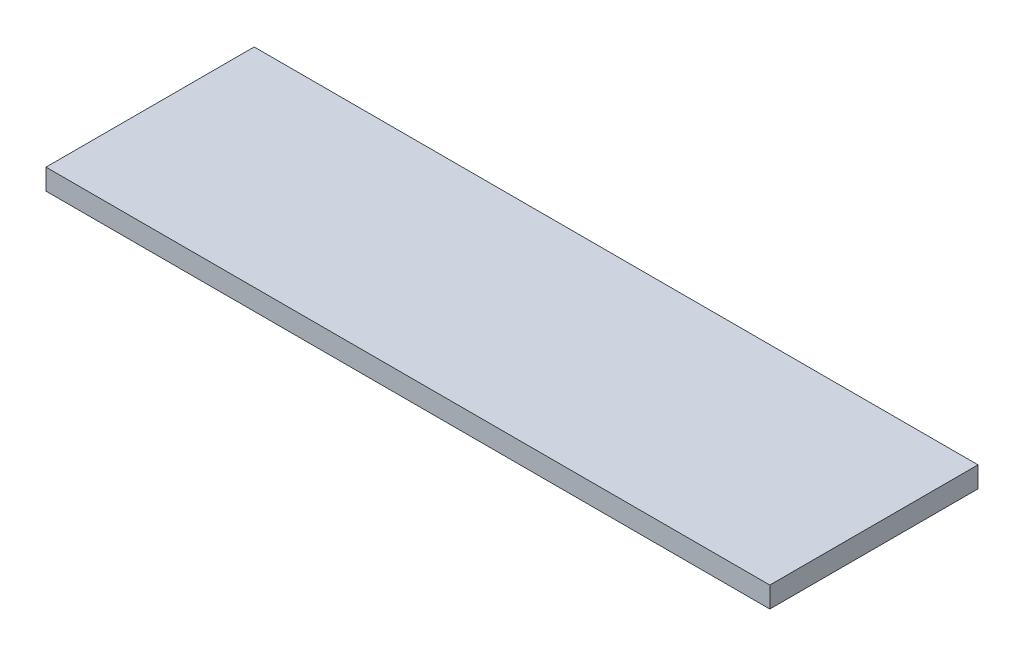
ISO-10303-21;
HEADER;
FILE_DESCRIPTION(('STEP AP214'),'2;1');
FILE_NAME('part.step','',(''),(''),'','','');
FILE_SCHEMA(('AUTOMOTIVE_DESIGN { 1 0 10303 214 1 1 1 1 }'));
ENDSEC;
DATA;
#1=APPLICATION_CONTEXT('core data for automotive mechanical design processes');
#2=APPLICATION_PROTOCOL_DEFINITION('international standard','automotive_design',2000,#1);
#3=PRODUCT_CONTEXT('',#1,'mechanical');
#4=PRODUCT('Part','Part','',(#3));
#5=PRODUCT_RELATED_PRODUCT_CATEGORY('part','',(#4));
#6=PRODUCT_DEFINITION_FORMATION('','',#4);
#7=PRODUCT_DEFINITION_CONTEXT('part definition',#1,'design');
#8=PRODUCT_DEFINITION('design','',#6,#7);
#9=PRODUCT_DEFINITION_SHAPE('','',#8);
#10=(LENGTH_UNIT() NAMED_UNIT(*) SI_UNIT(.MILLI.,.METRE.));
#11=(NAMED_UNIT(*) PLANE_ANGLE_UNIT() SI_UNIT($,.RADIAN.));
#12=(NAMED_UNIT(*) SI_UNIT($,.STERADIAN.) SOLID_ANGLE_UNIT());
#13=UNCERTAINTY_MEASURE_WITH_UNIT(LENGTH_MEASURE(1.E-05),#10,'distance_accuracy_value','');
#14=(GEOMETRIC_REPRESENTATION_CONTEXT(3) GLOBAL_UNCERTAINTY_ASSIGNED_CONTEXT((#13)) GLOBAL_UNIT_ASSIGNED_CONTEXT((#10,
#11,#12)) REPRESENTATION_CONTEXT('',''));
#15=CARTESIAN_POINT('',(0.,0.,0.));
#16=DIRECTION('',(0.,0.,1.));
#17=DIRECTION('',(1.,0.,0.));
#18=AXIS2_PLACEMENT_3D('',#15,#16,#17);
#19=CARTESIAN_POINT('',(18.7699111843078,2.,10.));
#20=DIRECTION('',(0.,0.,1.));
#21=DIRECTION('',(0.,-1.,0.));
#22=AXIS2_PLACEMENT_3D('',#19,#20,#21);
#23=PLANE('',#22);
#24=DIRECTION('',(1.,0.,0.));
#25=VECTOR('',#24,1.);
#26=CARTESIAN_POINT('',(19.7699111843078,0.,10.));
#27=LINE('',#26,#25);
#28=CARTESIAN_POINT('',(0.,0.,10.));
#29=VERTEX_POINT('',#28);
#30=CARTESIAN_POINT('',(34.7699111843078,0.,10.));
#31=VERTEX_POINT('',#30);
#32=EDGE_CURVE('E102',#29,#31,#27,.T.);
#33=ORIENTED_EDGE('',*,*,#32,.F.);
#34=DIRECTION('',(0.,1.,0.));
#35=VECTOR('',#34,1.);
#36=CARTESIAN_POINT('',(0.,-1.,10.));
#37=LINE('',#36,#35);
#38=CARTESIAN_POINT('',(0.,-1.,10.));
#39=VERTEX_POINT('',#38);
#40=EDGE_CURVE('E99',#39,#29,#37,.T.);
#41=ORIENTED_EDGE('',*,*,#40,.F.);
#42=DIRECTION('',(1.,0.,0.));
#43=VECTOR('',#42,1.);
#44=CARTESIAN_POINT('',(19.7699111843078,-1.,10.));
#45=LINE('',#44,#43);
#46=CARTESIAN_POINT('',(34.7699111843078,-1.,10.));
#47=VERTEX_POINT('',#46);
#48=EDGE_CURVE('E88',#39,#47,#45,.T.);
#49=ORIENTED_EDGE('',*,*,#48,.T.);
#50=DIRECTION('',(0.,-1.,0.));
#51=VECTOR('',#50,1.);
#52=CARTESIAN_POINT('',(34.7699111843078,0.,10.));
#53=LINE('',#52,#51);
#54=EDGE_CURVE('E91',#31,#47,#53,.T.);
#55=ORIENTED_EDGE('',*,*,#54,.F.);
#56=EDGE_LOOP('',(#33,#41,#49,#55));
#57=FACE_BOUND('',#56,.T.);
#58=ADVANCED_FACE('F44',(#57),#23,.T.);
#59=CARTESIAN_POINT('',(19.7699111843078,-1.,10.));
#60=DIRECTION('',(0.,1.,0.));
#61=DIRECTION('',(0.,0.,1.));
#62=AXIS2_PLACEMENT_3D('',#59,#60,#61);
#63=PLANE('',#62);
#64=DIRECTION('',(1.,0.,0.));
#65=VECTOR('',#64,1.);
#66=CARTESIAN_POINT('',(19.7699111843078,-1.,0.));
#67=LINE('',#66,#65);
#68=CARTESIAN_POINT('',(0.,-1.,0.));
#69=VERTEX_POINT('',#68);
#70=CARTESIAN_POINT('',(34.7699111843078,-1.,0.));
#71=VERTEX_POINT('',#70);
#72=EDGE_CURVE('E77',#69,#71,#67,.T.);
#73=ORIENTED_EDGE('',*,*,#72,.T.);
#74=DIRECTION('',(0.,0.,-1.));
#75=VECTOR('',#74,1.);
#76=CARTESIAN_POINT('',(34.7699111843078,-1.,10.));
#77=LINE('',#76,#75);
#78=EDGE_CURVE('E12',#47,#71,#77,.T.);
#79=ORIENTED_EDGE('',*,*,#78,.F.);
#80=ORIENTED_EDGE('',*,*,#48,.F.);
#81=DIRECTION('',(0.,0.,-1.));
#82=VECTOR('',#81,1.);
#83=CARTESIAN_POINT('',(0.,-1.,10.));
#84=LINE('',#83,#82);
#85=EDGE_CURVE('E90',#39,#69,#84,.T.);
#86=ORIENTED_EDGE('',*,*,#85,.T.);
#87=EDGE_LOOP('',(#73,#79,#80,#86));
#88=FACE_BOUND('',#87,.T.);
#89=ADVANCED_FACE('F86',(#88),#63,.F.);
#90=CARTESIAN_POINT('',(34.7699111843078,0.,10.));
#91=DIRECTION('',(1.,0.,0.));
#92=DIRECTION('',(0.,0.,1.));
#93=AXIS2_PLACEMENT_3D('',#90,#91,#92);
#94=PLANE('',#93);
#95=DIRECTION('',(0.,-1.,0.));
#96=VECTOR('',#95,1.);
#97=CARTESIAN_POINT('',(34.7699111843078,0.,0.));
#98=LINE('',#97,#96);
#99=CARTESIAN_POINT('',(34.7699111843078,0.,0.));
#100=VERTEX_POINT('',#99);
#101=EDGE_CURVE('E111',#100,#71,#98,.T.);
#102=ORIENTED_EDGE('',*,*,#101,.F.);
#103=DIRECTION('',(0.,0.,-1.));
#104=VECTOR('',#103,1.);
#105=CARTESIAN_POINT('',(34.7699111843078,0.,10.));
#106=LINE('',#105,#104);
#107=EDGE_CURVE('E53',#31,#100,#106,.T.);
#108=ORIENTED_EDGE('',*,*,#107,.F.);
#109=ORIENTED_EDGE('',*,*,#54,.T.);
#110=ORIENTED_EDGE('',*,*,#78,.T.);
#111=EDGE_LOOP('',(#102,#108,#109,#110));
#112=FACE_BOUND('',#111,.T.);
#113=ADVANCED_FACE('F118',(#112),#94,.T.);
#114=CARTESIAN_POINT('',(0.,0.,10.));
#115=DIRECTION('',(0.,1.,0.));
#116=DIRECTION('',(0.,0.,1.));
#117=AXIS2_PLACEMENT_3D('',#114,#115,#116);
#118=PLANE('',#117);
#119=DIRECTION('',(1.,0.,0.));
#120=VECTOR('',#119,1.);
#121=CARTESIAN_POINT('',(19.7699111843078,0.,0.));
#122=LINE('',#121,#120);
#123=CARTESIAN_POINT('',(0.,0.,0.));
#124=VERTEX_POINT('',#123);
#125=EDGE_CURVE('E94',#124,#100,#122,.T.);
#126=ORIENTED_EDGE('',*,*,#125,.F.);
#127=DIRECTION('',(0.,0.,-1.));
#128=VECTOR('',#127,1.);
#129=CARTESIAN_POINT('',(0.,0.,10.));
#130=LINE('',#129,#128);
#131=EDGE_CURVE('E106',#29,#124,#130,.T.);
#132=ORIENTED_EDGE('',*,*,#131,.F.);
#133=ORIENTED_EDGE('',*,*,#32,.T.);
#134=ORIENTED_EDGE('',*,*,#107,.T.);
#135=EDGE_LOOP('',(#126,#132,#133,#134));
#136=FACE_BOUND('',#135,.T.);
#137=ADVANCED_FACE('F50',(#136),#118,.T.);
#138=CARTESIAN_POINT('',(21.7699111843078,2.,0.));
#139=DIRECTION('',(0.,0.,-1.));
#140=DIRECTION('',(0.,1.,0.));
#141=AXIS2_PLACEMENT_3D('',#138,#139,#140);
#142=PLANE('',#141);
#143=ORIENTED_EDGE('',*,*,#72,.F.);
#144=DIRECTION('',(0.,1.,0.));
#145=VECTOR('',#144,1.);
#146=CARTESIAN_POINT('',(0.,-1.,0.));
#147=LINE('',#146,#145);
#148=EDGE_CURVE('E101',#69,#124,#147,.T.);
#149=ORIENTED_EDGE('',*,*,#148,.T.);
#150=ORIENTED_EDGE('',*,*,#125,.T.);
#151=ORIENTED_EDGE('',*,*,#101,.T.);
#152=EDGE_LOOP('',(#143,#149,#150,#151));
#153=FACE_BOUND('',#152,.T.);
#154=ADVANCED_FACE('F119',(#153),#142,.T.);
#155=CARTESIAN_POINT('',(0.,-1.,10.));
#156=DIRECTION('',(-1.,0.,0.));
#157=DIRECTION('',(0.,0.,1.));
#158=AXIS2_PLACEMENT_3D('',#155,#156,#157);
#159=PLANE('',#158);
#160=ORIENTED_EDGE('',*,*,#148,.F.);
#161=ORIENTED_EDGE('',*,*,#85,.F.);
#162=ORIENTED_EDGE('',*,*,#40,.T.);
#163=ORIENTED_EDGE('',*,*,#131,.T.);
#164=EDGE_LOOP('',(#160,#161,#162,#163));
#165=FACE_BOUND('',#164,.T.);
#166=ADVANCED_FACE('F98',(#165),#159,.T.);
#167=CLOSED_SHELL('',(#58,#89,#113,#137,#154,#166));
#168=MANIFOLD_SOLID_BREP('B2',#167);
#169=ADVANCED_BREP_SHAPE_REPRESENTATION('',(#18,#168),#14);
#170=SHAPE_DEFINITION_REPRESENTATION(#9,#169);
ENDSEC;
END-ISO-10303-21;
